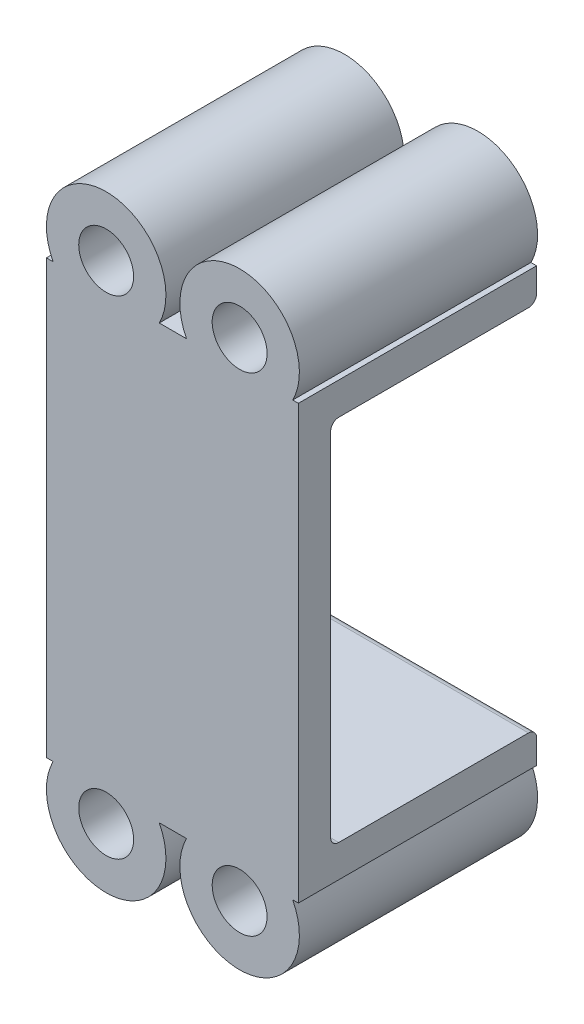
ISO-10303-21;
HEADER;
FILE_DESCRIPTION(('STEP AP214'),'2;1');
FILE_NAME('part.step','',(''),(''),'','','');
FILE_SCHEMA(('AUTOMOTIVE_DESIGN { 1 0 10303 214 1 1 1 1 }'));
ENDSEC;
DATA;
#1=APPLICATION_CONTEXT('core data for automotive mechanical design processes');
#2=APPLICATION_PROTOCOL_DEFINITION('international standard','automotive_design',2000,#1);
#3=PRODUCT_CONTEXT('',#1,'mechanical');
#4=PRODUCT('Part','Part','',(#3));
#5=PRODUCT_RELATED_PRODUCT_CATEGORY('part','',(#4));
#6=PRODUCT_DEFINITION_FORMATION('','',#4);
#7=PRODUCT_DEFINITION_CONTEXT('part definition',#1,'design');
#8=PRODUCT_DEFINITION('design','',#6,#7);
#9=PRODUCT_DEFINITION_SHAPE('','',#8);
#10=(LENGTH_UNIT() NAMED_UNIT(*) SI_UNIT(.MILLI.,.METRE.));
#11=(NAMED_UNIT(*) PLANE_ANGLE_UNIT() SI_UNIT($,.RADIAN.));
#12=(NAMED_UNIT(*) SI_UNIT($,.STERADIAN.) SOLID_ANGLE_UNIT());
#13=UNCERTAINTY_MEASURE_WITH_UNIT(LENGTH_MEASURE(1.E-05),#10,'distance_accuracy_value','');
#14=(GEOMETRIC_REPRESENTATION_CONTEXT(3) GLOBAL_UNCERTAINTY_ASSIGNED_CONTEXT((#13)) GLOBAL_UNIT_ASSIGNED_CONTEXT((#10,
#11,#12)) REPRESENTATION_CONTEXT('',''));
#15=CARTESIAN_POINT('',(0.,0.,0.));
#16=DIRECTION('',(0.,0.,1.));
#17=DIRECTION('',(1.,0.,0.));
#18=AXIS2_PLACEMENT_3D('',#15,#16,#17);
#19=CARTESIAN_POINT('',(-7.83156717792366,11.4,2.));
#20=DIRECTION('',(1.,0.,0.));
#21=DIRECTION('',(0.,1.,0.));
#22=AXIS2_PLACEMENT_3D('',#19,#20,#21);
#23=PLANE('',#22);
#24=DIRECTION('',(0.,0.,1.));
#25=VECTOR('',#24,1.);
#26=CARTESIAN_POINT('',(-7.83156717792366,-11.4,-12.75));
#27=LINE('',#26,#25);
#28=CARTESIAN_POINT('',(-7.83156717792366,-11.4,-12.25));
#29=VERTEX_POINT('',#28);
#30=CARTESIAN_POINT('',(-7.83156717792366,-11.4,-0.5));
#31=VERTEX_POINT('',#30);
#32=EDGE_CURVE('E232',#29,#31,#27,.T.);
#33=ORIENTED_EDGE('',*,*,#32,.F.);
#34=CARTESIAN_POINT('',(-7.83156717792366,-11.9,-12.25));
#35=DIRECTION('',(1.,0.,0.));
#36=DIRECTION('',(0.,1.,0.));
#37=AXIS2_PLACEMENT_3D('',#34,#35,#36);
#38=CIRCLE('',#37,0.5);
#39=CARTESIAN_POINT('',(-7.83156717792366,-11.9,-12.75));
#40=VERTEX_POINT('',#39);
#41=EDGE_CURVE('E289',#29,#40,#38,.F.);
#42=ORIENTED_EDGE('',*,*,#41,.T.);
#43=DIRECTION('',(0.,-1.,0.));
#44=VECTOR('',#43,1.);
#45=CARTESIAN_POINT('',(-7.83156717792366,-13.4,-12.75));
#46=LINE('',#45,#44);
#47=CARTESIAN_POINT('',(-7.83156717792366,-13.4,-12.75));
#48=VERTEX_POINT('',#47);
#49=EDGE_CURVE('E215',#40,#48,#46,.T.);
#50=ORIENTED_EDGE('',*,*,#49,.T.);
#51=DIRECTION('',(0.,0.,1.));
#52=VECTOR('',#51,1.);
#53=CARTESIAN_POINT('',(-7.83156717792366,-13.4,-12.75));
#54=LINE('',#53,#52);
#55=CARTESIAN_POINT('',(-7.83156717792366,-13.4,2.));
#56=VERTEX_POINT('',#55);
#57=EDGE_CURVE('E229',#48,#56,#54,.T.);
#58=ORIENTED_EDGE('',*,*,#57,.T.);
#59=DIRECTION('',(0.,-1.,0.));
#60=VECTOR('',#59,1.);
#61=CARTESIAN_POINT('',(-7.83156717792366,11.4,2.));
#62=LINE('',#61,#60);
#63=CARTESIAN_POINT('',(-7.83156717792366,13.4,2.));
#64=VERTEX_POINT('',#63);
#65=EDGE_CURVE('E264',#64,#56,#62,.T.);
#66=ORIENTED_EDGE('',*,*,#65,.F.);
#67=DIRECTION('',(0.,0.,1.));
#68=VECTOR('',#67,1.);
#69=CARTESIAN_POINT('',(-7.83156717792366,13.4,-12.75));
#70=LINE('',#69,#68);
#71=CARTESIAN_POINT('',(-7.83156717792366,13.4,-12.75));
#72=VERTEX_POINT('',#71);
#73=EDGE_CURVE('E273',#72,#64,#70,.T.);
#74=ORIENTED_EDGE('',*,*,#73,.F.);
#75=DIRECTION('',(0.,-1.,0.));
#76=VECTOR('',#75,1.);
#77=CARTESIAN_POINT('',(-7.83156717792366,13.4,-12.75));
#78=LINE('',#77,#76);
#79=CARTESIAN_POINT('',(-7.83156717792366,11.9,-12.75));
#80=VERTEX_POINT('',#79);
#81=EDGE_CURVE('E357',#72,#80,#78,.T.);
#82=ORIENTED_EDGE('',*,*,#81,.T.);
#83=CARTESIAN_POINT('',(-7.83156717792366,11.9,-12.25));
#84=DIRECTION('',(1.,0.,0.));
#85=DIRECTION('',(0.,1.,0.));
#86=AXIS2_PLACEMENT_3D('',#83,#84,#85);
#87=CIRCLE('',#86,0.5);
#88=CARTESIAN_POINT('',(-7.83156717792366,11.4,-12.25));
#89=VERTEX_POINT('',#88);
#90=EDGE_CURVE('E287',#80,#89,#87,.F.);
#91=ORIENTED_EDGE('',*,*,#90,.T.);
#92=DIRECTION('',(0.,0.,1.));
#93=VECTOR('',#92,1.);
#94=CARTESIAN_POINT('',(-7.83156717792366,11.4,-12.75));
#95=LINE('',#94,#93);
#96=CARTESIAN_POINT('',(-7.83156717792366,11.4,-0.5));
#97=VERTEX_POINT('',#96);
#98=EDGE_CURVE('E276',#89,#97,#95,.T.);
#99=ORIENTED_EDGE('',*,*,#98,.T.);
#100=CARTESIAN_POINT('',(-7.83156717792366,10.9,-0.5));
#101=DIRECTION('',(1.,0.,0.));
#102=DIRECTION('',(0.,1.,0.));
#103=AXIS2_PLACEMENT_3D('',#100,#101,#102);
#104=CIRCLE('',#103,0.5);
#105=CARTESIAN_POINT('',(-7.83156717792366,10.9,0.));
#106=VERTEX_POINT('',#105);
#107=EDGE_CURVE('E45',#97,#106,#104,.T.);
#108=ORIENTED_EDGE('',*,*,#107,.T.);
#109=DIRECTION('',(0.,-1.,0.));
#110=VECTOR('',#109,1.);
#111=CARTESIAN_POINT('',(-7.83156717792366,11.4,0.));
#112=LINE('',#111,#110);
#113=CARTESIAN_POINT('',(-7.83156717792366,-10.9,0.));
#114=VERTEX_POINT('',#113);
#115=EDGE_CURVE('E255',#106,#114,#112,.T.);
#116=ORIENTED_EDGE('',*,*,#115,.T.);
#117=CARTESIAN_POINT('',(-7.83156717792366,-10.9,-0.5));
#118=DIRECTION('',(1.,0.,0.));
#119=DIRECTION('',(0.,1.,0.));
#120=AXIS2_PLACEMENT_3D('',#117,#118,#119);
#121=CIRCLE('',#120,0.5);
#122=EDGE_CURVE('E308',#114,#31,#121,.T.);
#123=ORIENTED_EDGE('',*,*,#122,.T.);
#124=EDGE_LOOP('',(#33,#42,#50,#58,#66,#74,#82,#91,#99,#108,#116,#123));
#125=FACE_BOUND('',#124,.T.);
#126=ADVANCED_FACE('F37',(#125),#23,.F.);
#127=CARTESIAN_POINT('',(7.76843282207634,11.4,2.));
#128=DIRECTION('',(-1.,0.,0.));
#129=DIRECTION('',(0.,-1.,0.));
#130=AXIS2_PLACEMENT_3D('',#127,#128,#129);
#131=PLANE('',#130);
#132=DIRECTION('',(0.,1.,0.));
#133=VECTOR('',#132,1.);
#134=CARTESIAN_POINT('',(7.76843282207634,-13.4,-12.75));
#135=LINE('',#134,#133);
#136=CARTESIAN_POINT('',(7.76843282207634,-13.4,-12.75));
#137=VERTEX_POINT('',#136);
#138=CARTESIAN_POINT('',(7.76843282207634,-11.9,-12.75));
#139=VERTEX_POINT('',#138);
#140=EDGE_CURVE('E212',#137,#139,#135,.T.);
#141=ORIENTED_EDGE('',*,*,#140,.T.);
#142=CARTESIAN_POINT('',(7.76843282207634,-11.9,-12.25));
#143=DIRECTION('',(-1.,0.,0.));
#144=DIRECTION('',(0.,-1.,0.));
#145=AXIS2_PLACEMENT_3D('',#142,#143,#144);
#146=CIRCLE('',#145,0.5);
#147=CARTESIAN_POINT('',(7.76843282207634,-11.4,-12.25));
#148=VERTEX_POINT('',#147);
#149=EDGE_CURVE('E296',#139,#148,#146,.F.);
#150=ORIENTED_EDGE('',*,*,#149,.T.);
#151=DIRECTION('',(0.,0.,1.));
#152=VECTOR('',#151,1.);
#153=CARTESIAN_POINT('',(7.76843282207634,-11.4,-12.75));
#154=LINE('',#153,#152);
#155=CARTESIAN_POINT('',(7.76843282207634,-11.4,-0.5));
#156=VERTEX_POINT('',#155);
#157=EDGE_CURVE('E241',#148,#156,#154,.T.);
#158=ORIENTED_EDGE('',*,*,#157,.T.);
#159=CARTESIAN_POINT('',(7.76843282207634,-10.9,-0.5));
#160=DIRECTION('',(-1.,0.,0.));
#161=DIRECTION('',(0.,-1.,0.));
#162=AXIS2_PLACEMENT_3D('',#159,#160,#161);
#163=CIRCLE('',#162,0.5);
#164=CARTESIAN_POINT('',(7.76843282207634,-10.9,0.));
#165=VERTEX_POINT('',#164);
#166=EDGE_CURVE('E306',#156,#165,#163,.T.);
#167=ORIENTED_EDGE('',*,*,#166,.T.);
#168=DIRECTION('',(0.,1.,0.));
#169=VECTOR('',#168,1.);
#170=CARTESIAN_POINT('',(7.76843282207634,11.4,0.));
#171=LINE('',#170,#169);
#172=CARTESIAN_POINT('',(7.76843282207634,10.9,0.));
#173=VERTEX_POINT('',#172);
#174=EDGE_CURVE('E258',#165,#173,#171,.T.);
#175=ORIENTED_EDGE('',*,*,#174,.T.);
#176=CARTESIAN_POINT('',(7.76843282207634,10.9,-0.5));
#177=DIRECTION('',(-1.,0.,0.));
#178=DIRECTION('',(0.,-1.,0.));
#179=AXIS2_PLACEMENT_3D('',#176,#177,#178);
#180=CIRCLE('',#179,0.5);
#181=CARTESIAN_POINT('',(7.76843282207634,11.4,-0.5));
#182=VERTEX_POINT('',#181);
#183=EDGE_CURVE('E11',#173,#182,#180,.T.);
#184=ORIENTED_EDGE('',*,*,#183,.T.);
#185=DIRECTION('',(0.,0.,1.));
#186=VECTOR('',#185,1.);
#187=CARTESIAN_POINT('',(7.76843282207634,11.4,-12.75));
#188=LINE('',#187,#186);
#189=CARTESIAN_POINT('',(7.76843282207634,11.4,-12.25));
#190=VERTEX_POINT('',#189);
#191=EDGE_CURVE('E285',#190,#182,#188,.T.);
#192=ORIENTED_EDGE('',*,*,#191,.F.);
#193=CARTESIAN_POINT('',(7.76843282207634,11.9,-12.25));
#194=DIRECTION('',(-1.,0.,0.));
#195=DIRECTION('',(0.,-1.,0.));
#196=AXIS2_PLACEMENT_3D('',#193,#194,#195);
#197=CIRCLE('',#196,0.5);
#198=CARTESIAN_POINT('',(7.76843282207634,11.9,-12.75));
#199=VERTEX_POINT('',#198);
#200=EDGE_CURVE('E52',#190,#199,#197,.F.);
#201=ORIENTED_EDGE('',*,*,#200,.T.);
#202=DIRECTION('',(0.,1.,0.));
#203=VECTOR('',#202,1.);
#204=CARTESIAN_POINT('',(7.76843282207634,13.4,-12.75));
#205=LINE('',#204,#203);
#206=CARTESIAN_POINT('',(7.76843282207634,13.4,-12.75));
#207=VERTEX_POINT('',#206);
#208=EDGE_CURVE('E361',#199,#207,#205,.T.);
#209=ORIENTED_EDGE('',*,*,#208,.T.);
#210=DIRECTION('',(0.,0.,1.));
#211=VECTOR('',#210,1.);
#212=CARTESIAN_POINT('',(7.76843282207634,13.4,-12.75));
#213=LINE('',#212,#211);
#214=CARTESIAN_POINT('',(7.76843282207634,13.4,2.));
#215=VERTEX_POINT('',#214);
#216=EDGE_CURVE('E294',#207,#215,#213,.T.);
#217=ORIENTED_EDGE('',*,*,#216,.T.);
#218=DIRECTION('',(0.,1.,0.));
#219=VECTOR('',#218,1.);
#220=CARTESIAN_POINT('',(7.76843282207634,11.4,2.));
#221=LINE('',#220,#219);
#222=CARTESIAN_POINT('',(7.76843282207634,-13.4,2.));
#223=VERTEX_POINT('',#222);
#224=EDGE_CURVE('E251',#223,#215,#221,.T.);
#225=ORIENTED_EDGE('',*,*,#224,.F.);
#226=DIRECTION('',(0.,0.,1.));
#227=VECTOR('',#226,1.);
#228=CARTESIAN_POINT('',(7.76843282207634,-13.4,-12.75));
#229=LINE('',#228,#227);
#230=EDGE_CURVE('E246',#137,#223,#229,.T.);
#231=ORIENTED_EDGE('',*,*,#230,.F.);
#232=EDGE_LOOP('',(#141,#150,#158,#167,#175,#184,#192,#201,#209,#217,#225,#231));
#233=FACE_BOUND('',#232,.T.);
#234=ADVANCED_FACE('F324',(#233),#131,.F.);
#235=CARTESIAN_POINT('',(0.,0.,2.));
#236=DIRECTION('',(0.,0.,1.));
#237=DIRECTION('',(1.,0.,0.));
#238=AXIS2_PLACEMENT_3D('',#235,#236,#237);
#239=PLANE('',#238);
#240=ORIENTED_EDGE('',*,*,#65,.T.);
#241=DIRECTION('',(1.,0.,0.));
#242=VECTOR('',#241,1.);
#243=CARTESIAN_POINT('',(-7.41790252295466,-13.4,2.));
#244=LINE('',#243,#242);
#245=CARTESIAN_POINT('',(-7.41790252295466,-13.4,2.));
#246=VERTEX_POINT('',#245);
#247=EDGE_CURVE('E199',#56,#246,#244,.T.);
#248=ORIENTED_EDGE('',*,*,#247,.T.);
#249=CARTESIAN_POINT('',(-4.13156717792366,-15.1,2.));
#250=DIRECTION('',(0.,0.,1.));
#251=DIRECTION('',(1.,0.,0.));
#252=AXIS2_PLACEMENT_3D('',#249,#250,#251);
#253=CIRCLE('',#252,3.7);
#254=CARTESIAN_POINT('',(-0.845231832892662,-13.4,2.));
#255=VERTEX_POINT('',#254);
#256=EDGE_CURVE('E218',#246,#255,#253,.T.);
#257=ORIENTED_EDGE('',*,*,#256,.T.);
#258=DIRECTION('',(1.,0.,0.));
#259=VECTOR('',#258,1.);
#260=CARTESIAN_POINT('',(0.845231832892663,-13.4,2.));
#261=LINE('',#260,#259);
#262=CARTESIAN_POINT('',(0.845231832892664,-13.4,2.));
#263=VERTEX_POINT('',#262);
#264=EDGE_CURVE('E177',#255,#263,#261,.T.);
#265=ORIENTED_EDGE('',*,*,#264,.T.);
#266=CARTESIAN_POINT('',(4.13156717792366,-15.1,2.));
#267=DIRECTION('',(0.,0.,1.));
#268=DIRECTION('',(-1.,0.,0.));
#269=AXIS2_PLACEMENT_3D('',#266,#267,#268);
#270=CIRCLE('',#269,3.7);
#271=CARTESIAN_POINT('',(7.41790252295466,-13.4,2.));
#272=VERTEX_POINT('',#271);
#273=EDGE_CURVE('E222',#263,#272,#270,.T.);
#274=ORIENTED_EDGE('',*,*,#273,.T.);
#275=DIRECTION('',(1.,0.,0.));
#276=VECTOR('',#275,1.);
#277=CARTESIAN_POINT('',(7.76843282207634,-13.4,2.));
#278=LINE('',#277,#276);
#279=EDGE_CURVE('E202',#272,#223,#278,.T.);
#280=ORIENTED_EDGE('',*,*,#279,.T.);
#281=ORIENTED_EDGE('',*,*,#224,.T.);
#282=DIRECTION('',(-1.,0.,0.));
#283=VECTOR('',#282,1.);
#284=CARTESIAN_POINT('',(7.76843282207634,13.4,2.));
#285=LINE('',#284,#283);
#286=CARTESIAN_POINT('',(7.41790252295466,13.4,2.));
#287=VERTEX_POINT('',#286);
#288=EDGE_CURVE('E384',#215,#287,#285,.T.);
#289=ORIENTED_EDGE('',*,*,#288,.T.);
#290=CARTESIAN_POINT('',(4.13156717792366,15.1,2.));
#291=DIRECTION('',(0.,0.,1.));
#292=DIRECTION('',(1.,0.,0.));
#293=AXIS2_PLACEMENT_3D('',#290,#291,#292);
#294=CIRCLE('',#293,3.7);
#295=CARTESIAN_POINT('',(0.845231832892663,13.4,2.));
#296=VERTEX_POINT('',#295);
#297=EDGE_CURVE('E371',#287,#296,#294,.T.);
#298=ORIENTED_EDGE('',*,*,#297,.T.);
#299=DIRECTION('',(-1.,0.,0.));
#300=VECTOR('',#299,1.);
#301=CARTESIAN_POINT('',(0.845231832892663,13.4,2.));
#302=LINE('',#301,#300);
#303=CARTESIAN_POINT('',(-0.845231832892663,13.4,2.));
#304=VERTEX_POINT('',#303);
#305=EDGE_CURVE('E374',#296,#304,#302,.T.);
#306=ORIENTED_EDGE('',*,*,#305,.T.);
#307=CARTESIAN_POINT('',(-4.13156717792366,15.1,2.));
#308=DIRECTION('',(0.,0.,1.));
#309=DIRECTION('',(-1.,0.,0.));
#310=AXIS2_PLACEMENT_3D('',#307,#308,#309);
#311=CIRCLE('',#310,3.7);
#312=CARTESIAN_POINT('',(-7.41790252295466,13.4,2.));
#313=VERTEX_POINT('',#312);
#314=EDGE_CURVE('E378',#304,#313,#311,.T.);
#315=ORIENTED_EDGE('',*,*,#314,.T.);
#316=DIRECTION('',(-1.,0.,0.));
#317=VECTOR('',#316,1.);
#318=CARTESIAN_POINT('',(-7.41790252295466,13.4,2.));
#319=LINE('',#318,#317);
#320=EDGE_CURVE('E381',#313,#64,#319,.T.);
#321=ORIENTED_EDGE('',*,*,#320,.T.);
#322=EDGE_LOOP('',(#240,#248,#257,#265,#274,#280,#281,#289,#298,#306,#315,#321));
#323=FACE_BOUND('',#322,.T.);
#324=CARTESIAN_POINT('',(-4.13156717792366,15.1,2.));
#325=DIRECTION('',(0.,0.,1.));
#326=DIRECTION('',(-1.,0.,0.));
#327=AXIS2_PLACEMENT_3D('',#324,#325,#326);
#328=CIRCLE('',#327,1.7);
#329=CARTESIAN_POINT('',(-5.83156717792366,15.1,2.));
#330=VERTEX_POINT('',#329);
#331=EDGE_CURVE('E228',#330,#330,#328,.T.);
#332=ORIENTED_EDGE('',*,*,#331,.F.);
#333=EDGE_LOOP('',(#332));
#334=FACE_BOUND('',#333,.T.);
#335=CARTESIAN_POINT('',(4.13156717792366,15.1,2.));
#336=DIRECTION('',(0.,0.,1.));
#337=DIRECTION('',(1.,0.,0.));
#338=AXIS2_PLACEMENT_3D('',#335,#336,#337);
#339=CIRCLE('',#338,1.7);
#340=CARTESIAN_POINT('',(5.83156717792366,15.1,2.));
#341=VERTEX_POINT('',#340);
#342=EDGE_CURVE('E408',#341,#341,#339,.T.);
#343=ORIENTED_EDGE('',*,*,#342,.F.);
#344=EDGE_LOOP('',(#343));
#345=FACE_BOUND('',#344,.T.);
#346=CARTESIAN_POINT('',(4.13156717792366,-15.1,2.));
#347=DIRECTION('',(0.,0.,1.));
#348=DIRECTION('',(-1.,0.,0.));
#349=AXIS2_PLACEMENT_3D('',#346,#347,#348);
#350=CIRCLE('',#349,1.7);
#351=CARTESIAN_POINT('',(2.43156717792366,-15.1,2.));
#352=VERTEX_POINT('',#351);
#353=EDGE_CURVE('E497',#352,#352,#350,.T.);
#354=ORIENTED_EDGE('',*,*,#353,.F.);
#355=EDGE_LOOP('',(#354));
#356=FACE_BOUND('',#355,.T.);
#357=CARTESIAN_POINT('',(-4.13156717792366,-15.1,2.));
#358=DIRECTION('',(0.,0.,1.));
#359=DIRECTION('',(1.,0.,0.));
#360=AXIS2_PLACEMENT_3D('',#357,#358,#359);
#361=CIRCLE('',#360,1.7);
#362=CARTESIAN_POINT('',(-2.43156717792366,-15.1,2.));
#363=VERTEX_POINT('',#362);
#364=EDGE_CURVE('E205',#363,#363,#361,.T.);
#365=ORIENTED_EDGE('',*,*,#364,.F.);
#366=EDGE_LOOP('',(#365));
#367=FACE_BOUND('',#366,.T.);
#368=ADVANCED_FACE('F328',(#323,#334,#345,#356,#367),#239,.T.);
#369=CARTESIAN_POINT('',(0.,0.,0.));
#370=DIRECTION('',(0.,0.,1.));
#371=DIRECTION('',(1.,0.,0.));
#372=AXIS2_PLACEMENT_3D('',#369,#370,#371);
#373=PLANE('',#372);
#374=ORIENTED_EDGE('',*,*,#174,.F.);
#375=DIRECTION('',(1.,0.,0.));
#376=VECTOR('',#375,1.);
#377=CARTESIAN_POINT('',(0.,-10.9,0.));
#378=LINE('',#377,#376);
#379=EDGE_CURVE('E286',#165,#114,#378,.F.);
#380=ORIENTED_EDGE('',*,*,#379,.T.);
#381=ORIENTED_EDGE('',*,*,#115,.F.);
#382=DIRECTION('',(-1.,0.,0.));
#383=VECTOR('',#382,1.);
#384=CARTESIAN_POINT('',(0.,10.9,0.));
#385=LINE('',#384,#383);
#386=EDGE_CURVE('E254',#106,#173,#385,.F.);
#387=ORIENTED_EDGE('',*,*,#386,.T.);
#388=EDGE_LOOP('',(#374,#380,#381,#387));
#389=FACE_BOUND('',#388,.T.);
#390=ADVANCED_FACE('F319',(#389),#373,.F.);
#391=CARTESIAN_POINT('',(4.13156717792366,15.1,-12.75));
#392=DIRECTION('',(0.,0.,1.));
#393=DIRECTION('',(1.,0.,0.));
#394=AXIS2_PLACEMENT_3D('',#391,#392,#393);
#395=CYLINDRICAL_SURFACE('',#394,3.7);
#396=ORIENTED_EDGE('',*,*,#297,.F.);
#397=DIRECTION('',(0.,0.,1.));
#398=VECTOR('',#397,1.);
#399=CARTESIAN_POINT('',(7.41790252295466,13.4,-12.75));
#400=LINE('',#399,#398);
#401=CARTESIAN_POINT('',(7.41790252295466,13.4,-12.75));
#402=VERTEX_POINT('',#401);
#403=EDGE_CURVE('E259',#402,#287,#400,.T.);
#404=ORIENTED_EDGE('',*,*,#403,.F.);
#405=CARTESIAN_POINT('',(4.13156717792366,15.1,-12.75));
#406=DIRECTION('',(0.,0.,1.));
#407=DIRECTION('',(1.,0.,0.));
#408=AXIS2_PLACEMENT_3D('',#405,#406,#407);
#409=CIRCLE('',#408,3.7);
#410=CARTESIAN_POINT('',(0.845231832892663,13.4,-12.75));
#411=VERTEX_POINT('',#410);
#412=EDGE_CURVE('E387',#402,#411,#409,.T.);
#413=ORIENTED_EDGE('',*,*,#412,.T.);
#414=DIRECTION('',(0.,0.,1.));
#415=VECTOR('',#414,1.);
#416=CARTESIAN_POINT('',(0.845231832892663,13.4,-12.75));
#417=LINE('',#416,#415);
#418=EDGE_CURVE('E266',#411,#296,#417,.T.);
#419=ORIENTED_EDGE('',*,*,#418,.T.);
#420=EDGE_LOOP('',(#396,#404,#413,#419));
#421=FACE_BOUND('',#420,.T.);
#422=ADVANCED_FACE('F432',(#421),#395,.T.);
#423=CARTESIAN_POINT('',(7.76843282207634,13.4,-12.75));
#424=DIRECTION('',(0.,1.,0.));
#425=DIRECTION('',(-1.,0.,0.));
#426=AXIS2_PLACEMENT_3D('',#423,#424,#425);
#427=PLANE('',#426);
#428=ORIENTED_EDGE('',*,*,#288,.F.);
#429=ORIENTED_EDGE('',*,*,#216,.F.);
#430=DIRECTION('',(-1.,0.,0.));
#431=VECTOR('',#430,1.);
#432=CARTESIAN_POINT('',(7.76843282207634,13.4,-12.75));
#433=LINE('',#432,#431);
#434=EDGE_CURVE('E269',#207,#402,#433,.T.);
#435=ORIENTED_EDGE('',*,*,#434,.T.);
#436=ORIENTED_EDGE('',*,*,#403,.T.);
#437=EDGE_LOOP('',(#428,#429,#435,#436));
#438=FACE_BOUND('',#437,.T.);
#439=ADVANCED_FACE('F394',(#438),#427,.T.);
#440=CARTESIAN_POINT('',(-7.83156717792366,11.4,-12.75));
#441=DIRECTION('',(0.,-1.,0.));
#442=DIRECTION('',(0.,0.,-1.));
#443=AXIS2_PLACEMENT_3D('',#440,#441,#442);
#444=PLANE('',#443);
#445=ORIENTED_EDGE('',*,*,#98,.F.);
#446=DIRECTION('',(1.,0.,0.));
#447=VECTOR('',#446,1.);
#448=CARTESIAN_POINT('',(7.76843282207634,11.4,-12.25));
#449=LINE('',#448,#447);
#450=EDGE_CURVE('E301',#89,#190,#449,.T.);
#451=ORIENTED_EDGE('',*,*,#450,.T.);
#452=ORIENTED_EDGE('',*,*,#191,.T.);
#453=DIRECTION('',(-1.,0.,0.));
#454=VECTOR('',#453,1.);
#455=CARTESIAN_POINT('',(-7.83156717792366,11.4,-0.5));
#456=LINE('',#455,#454);
#457=EDGE_CURVE('E298',#182,#97,#456,.T.);
#458=ORIENTED_EDGE('',*,*,#457,.T.);
#459=EDGE_LOOP('',(#445,#451,#452,#458));
#460=FACE_BOUND('',#459,.T.);
#461=ADVANCED_FACE('F322',(#460),#444,.T.);
#462=CARTESIAN_POINT('',(-7.41790252295466,13.4,-12.75));
#463=DIRECTION('',(0.,1.,0.));
#464=DIRECTION('',(-1.,0.,0.));
#465=AXIS2_PLACEMENT_3D('',#462,#463,#464);
#466=PLANE('',#465);
#467=ORIENTED_EDGE('',*,*,#320,.F.);
#468=DIRECTION('',(0.,0.,1.));
#469=VECTOR('',#468,1.);
#470=CARTESIAN_POINT('',(-7.41790252295466,13.4,-12.75));
#471=LINE('',#470,#469);
#472=CARTESIAN_POINT('',(-7.41790252295466,13.4,-12.75));
#473=VERTEX_POINT('',#472);
#474=EDGE_CURVE('E271',#473,#313,#471,.T.);
#475=ORIENTED_EDGE('',*,*,#474,.F.);
#476=DIRECTION('',(-1.,0.,0.));
#477=VECTOR('',#476,1.);
#478=CARTESIAN_POINT('',(-7.41790252295466,13.4,-12.75));
#479=LINE('',#478,#477);
#480=EDGE_CURVE('E362',#473,#72,#479,.T.);
#481=ORIENTED_EDGE('',*,*,#480,.T.);
#482=ORIENTED_EDGE('',*,*,#73,.T.);
#483=EDGE_LOOP('',(#467,#475,#481,#482));
#484=FACE_BOUND('',#483,.T.);
#485=ADVANCED_FACE('F445',(#484),#466,.T.);
#486=CARTESIAN_POINT('',(-4.13156717792366,15.1,-12.75));
#487=DIRECTION('',(0.,0.,1.));
#488=DIRECTION('',(1.,0.,0.));
#489=AXIS2_PLACEMENT_3D('',#486,#487,#488);
#490=CYLINDRICAL_SURFACE('',#489,3.7);
#491=ORIENTED_EDGE('',*,*,#314,.F.);
#492=DIRECTION('',(0.,0.,1.));
#493=VECTOR('',#492,1.);
#494=CARTESIAN_POINT('',(-0.845231832892663,13.4,-12.75));
#495=LINE('',#494,#493);
#496=CARTESIAN_POINT('',(-0.845231832892663,13.4,-12.75));
#497=VERTEX_POINT('',#496);
#498=EDGE_CURVE('E268',#497,#304,#495,.T.);
#499=ORIENTED_EDGE('',*,*,#498,.F.);
#500=CARTESIAN_POINT('',(-4.13156717792366,15.1,-12.75));
#501=DIRECTION('',(0.,0.,1.));
#502=DIRECTION('',(-1.,0.,0.));
#503=AXIS2_PLACEMENT_3D('',#500,#501,#502);
#504=CIRCLE('',#503,3.7);
#505=EDGE_CURVE('E365',#497,#473,#504,.T.);
#506=ORIENTED_EDGE('',*,*,#505,.T.);
#507=ORIENTED_EDGE('',*,*,#474,.T.);
#508=EDGE_LOOP('',(#491,#499,#506,#507));
#509=FACE_BOUND('',#508,.T.);
#510=ADVANCED_FACE('F423',(#509),#490,.T.);
#511=CARTESIAN_POINT('',(0.845231832892663,13.4,-12.75));
#512=DIRECTION('',(0.,1.,0.));
#513=DIRECTION('',(-1.,0.,0.));
#514=AXIS2_PLACEMENT_3D('',#511,#512,#513);
#515=PLANE('',#514);
#516=ORIENTED_EDGE('',*,*,#305,.F.);
#517=ORIENTED_EDGE('',*,*,#418,.F.);
#518=DIRECTION('',(-1.,0.,0.));
#519=VECTOR('',#518,1.);
#520=CARTESIAN_POINT('',(0.845231832892663,13.4,-12.75));
#521=LINE('',#520,#519);
#522=EDGE_CURVE('E417',#411,#497,#521,.T.);
#523=ORIENTED_EDGE('',*,*,#522,.T.);
#524=ORIENTED_EDGE('',*,*,#498,.T.);
#525=EDGE_LOOP('',(#516,#517,#523,#524));
#526=FACE_BOUND('',#525,.T.);
#527=ADVANCED_FACE('F430',(#526),#515,.T.);
#528=CARTESIAN_POINT('',(4.13156717792366,15.1,-12.75));
#529=DIRECTION('',(0.,0.,1.));
#530=DIRECTION('',(1.,0.,0.));
#531=AXIS2_PLACEMENT_3D('',#528,#529,#530);
#532=PLANE('',#531);
#533=CARTESIAN_POINT('',(-4.13156717792366,15.1,-12.75));
#534=DIRECTION('',(0.,0.,1.));
#535=DIRECTION('',(-1.,0.,0.));
#536=AXIS2_PLACEMENT_3D('',#533,#534,#535);
#537=CIRCLE('',#536,1.7);
#538=CARTESIAN_POINT('',(-5.83156717792366,15.1,-12.75));
#539=VERTEX_POINT('',#538);
#540=EDGE_CURVE('E405',#539,#539,#537,.T.);
#541=ORIENTED_EDGE('',*,*,#540,.T.);
#542=EDGE_LOOP('',(#541));
#543=FACE_BOUND('',#542,.T.);
#544=CARTESIAN_POINT('',(4.13156717792366,15.1,-12.75));
#545=DIRECTION('',(0.,0.,1.));
#546=DIRECTION('',(1.,0.,0.));
#547=AXIS2_PLACEMENT_3D('',#544,#545,#546);
#548=CIRCLE('',#547,1.7);
#549=CARTESIAN_POINT('',(5.83156717792366,15.1,-12.75));
#550=VERTEX_POINT('',#549);
#551=EDGE_CURVE('E375',#550,#550,#548,.T.);
#552=ORIENTED_EDGE('',*,*,#551,.T.);
#553=EDGE_LOOP('',(#552));
#554=FACE_BOUND('',#553,.T.);
#555=ORIENTED_EDGE('',*,*,#208,.F.);
#556=DIRECTION('',(1.,0.,0.));
#557=VECTOR('',#556,1.);
#558=CARTESIAN_POINT('',(-7.83156717792366,11.9,-12.75));
#559=LINE('',#558,#557);
#560=EDGE_CURVE('E304',#199,#80,#559,.F.);
#561=ORIENTED_EDGE('',*,*,#560,.T.);
#562=ORIENTED_EDGE('',*,*,#81,.F.);
#563=ORIENTED_EDGE('',*,*,#480,.F.);
#564=ORIENTED_EDGE('',*,*,#505,.F.);
#565=ORIENTED_EDGE('',*,*,#522,.F.);
#566=ORIENTED_EDGE('',*,*,#412,.F.);
#567=ORIENTED_EDGE('',*,*,#434,.F.);
#568=EDGE_LOOP('',(#555,#561,#562,#563,#564,#565,#566,#567));
#569=FACE_BOUND('',#568,.T.);
#570=ADVANCED_FACE('F426',(#543,#554,#569),#532,.F.);
#571=CARTESIAN_POINT('',(4.13156717792366,15.1,-12.75));
#572=DIRECTION('',(0.,0.,1.));
#573=DIRECTION('',(1.,0.,0.));
#574=AXIS2_PLACEMENT_3D('',#571,#572,#573);
#575=CYLINDRICAL_SURFACE('',#574,1.7);
#576=ORIENTED_EDGE('',*,*,#551,.F.);
#577=EDGE_LOOP('',(#576));
#578=FACE_BOUND('',#577,.T.);
#579=ORIENTED_EDGE('',*,*,#342,.T.);
#580=EDGE_LOOP('',(#579));
#581=FACE_BOUND('',#580,.T.);
#582=ADVANCED_FACE('F453',(#578,#581),#575,.F.);
#583=CARTESIAN_POINT('',(-4.13156717792366,15.1,-12.75));
#584=DIRECTION('',(0.,0.,1.));
#585=DIRECTION('',(1.,0.,0.));
#586=AXIS2_PLACEMENT_3D('',#583,#584,#585);
#587=CYLINDRICAL_SURFACE('',#586,1.7);
#588=ORIENTED_EDGE('',*,*,#540,.F.);
#589=EDGE_LOOP('',(#588));
#590=FACE_BOUND('',#589,.T.);
#591=ORIENTED_EDGE('',*,*,#331,.T.);
#592=EDGE_LOOP('',(#591));
#593=FACE_BOUND('',#592,.T.);
#594=ADVANCED_FACE('F457',(#590,#593),#587,.F.);
#595=CARTESIAN_POINT('',(-4.13156717792366,-15.1,-12.75));
#596=DIRECTION('',(0.,0.,1.));
#597=DIRECTION('',(1.,0.,0.));
#598=AXIS2_PLACEMENT_3D('',#595,#596,#597);
#599=CYLINDRICAL_SURFACE('',#598,3.7);
#600=ORIENTED_EDGE('',*,*,#256,.F.);
#601=DIRECTION('',(0.,0.,1.));
#602=VECTOR('',#601,1.);
#603=CARTESIAN_POINT('',(-7.41790252295466,-13.4,-12.75));
#604=LINE('',#603,#602);
#605=CARTESIAN_POINT('',(-7.41790252295466,-13.4,-12.75));
#606=VERTEX_POINT('',#605);
#607=EDGE_CURVE('E198',#606,#246,#604,.T.);
#608=ORIENTED_EDGE('',*,*,#607,.F.);
#609=CARTESIAN_POINT('',(-4.13156717792366,-15.1,-12.75));
#610=DIRECTION('',(0.,0.,1.));
#611=DIRECTION('',(1.,0.,0.));
#612=AXIS2_PLACEMENT_3D('',#609,#610,#611);
#613=CIRCLE('',#612,3.7);
#614=CARTESIAN_POINT('',(-0.845231832892662,-13.4,-12.75));
#615=VERTEX_POINT('',#614);
#616=EDGE_CURVE('E191',#606,#615,#613,.T.);
#617=ORIENTED_EDGE('',*,*,#616,.T.);
#618=DIRECTION('',(0.,0.,1.));
#619=VECTOR('',#618,1.);
#620=CARTESIAN_POINT('',(-0.845231832892662,-13.4,-12.75));
#621=LINE('',#620,#619);
#622=EDGE_CURVE('E172',#615,#255,#621,.T.);
#623=ORIENTED_EDGE('',*,*,#622,.T.);
#624=EDGE_LOOP('',(#600,#608,#617,#623));
#625=FACE_BOUND('',#624,.T.);
#626=ADVANCED_FACE('F197',(#625),#599,.T.);
#627=CARTESIAN_POINT('',(-7.41790252295466,-13.4,-12.75));
#628=DIRECTION('',(0.,-1.,0.));
#629=DIRECTION('',(1.,0.,0.));
#630=AXIS2_PLACEMENT_3D('',#627,#628,#629);
#631=PLANE('',#630);
#632=ORIENTED_EDGE('',*,*,#247,.F.);
#633=ORIENTED_EDGE('',*,*,#57,.F.);
#634=DIRECTION('',(1.,0.,0.));
#635=VECTOR('',#634,1.);
#636=CARTESIAN_POINT('',(-7.41790252295466,-13.4,-12.75));
#637=LINE('',#636,#635);
#638=EDGE_CURVE('E183',#48,#606,#637,.T.);
#639=ORIENTED_EDGE('',*,*,#638,.T.);
#640=ORIENTED_EDGE('',*,*,#607,.T.);
#641=EDGE_LOOP('',(#632,#633,#639,#640));
#642=FACE_BOUND('',#641,.T.);
#643=ADVANCED_FACE('F464',(#642),#631,.T.);
#644=CARTESIAN_POINT('',(-7.83156717792366,-11.4,-12.75));
#645=DIRECTION('',(0.,1.,0.));
#646=DIRECTION('',(0.,0.,1.));
#647=AXIS2_PLACEMENT_3D('',#644,#645,#646);
#648=PLANE('',#647);
#649=ORIENTED_EDGE('',*,*,#32,.T.);
#650=DIRECTION('',(1.,0.,0.));
#651=VECTOR('',#650,1.);
#652=CARTESIAN_POINT('',(-7.83156717792366,-11.4,-0.5));
#653=LINE('',#652,#651);
#654=EDGE_CURVE('E250',#31,#156,#653,.T.);
#655=ORIENTED_EDGE('',*,*,#654,.T.);
#656=ORIENTED_EDGE('',*,*,#157,.F.);
#657=DIRECTION('',(-1.,0.,0.));
#658=VECTOR('',#657,1.);
#659=CARTESIAN_POINT('',(-7.83156717792366,-11.4,-12.25));
#660=LINE('',#659,#658);
#661=EDGE_CURVE('E247',#148,#29,#660,.T.);
#662=ORIENTED_EDGE('',*,*,#661,.T.);
#663=EDGE_LOOP('',(#649,#655,#656,#662));
#664=FACE_BOUND('',#663,.T.);
#665=ADVANCED_FACE('F473',(#664),#648,.T.);
#666=CARTESIAN_POINT('',(7.76843282207634,-13.4,-12.75));
#667=DIRECTION('',(0.,-1.,0.));
#668=DIRECTION('',(1.,0.,0.));
#669=AXIS2_PLACEMENT_3D('',#666,#667,#668);
#670=PLANE('',#669);
#671=ORIENTED_EDGE('',*,*,#279,.F.);
#672=DIRECTION('',(0.,0.,1.));
#673=VECTOR('',#672,1.);
#674=CARTESIAN_POINT('',(7.41790252295466,-13.4,-12.75));
#675=LINE('',#674,#673);
#676=CARTESIAN_POINT('',(7.41790252295466,-13.4,-12.75));
#677=VERTEX_POINT('',#676);
#678=EDGE_CURVE('E401',#677,#272,#675,.T.);
#679=ORIENTED_EDGE('',*,*,#678,.F.);
#680=DIRECTION('',(1.,0.,0.));
#681=VECTOR('',#680,1.);
#682=CARTESIAN_POINT('',(7.76843282207634,-13.4,-12.75));
#683=LINE('',#682,#681);
#684=EDGE_CURVE('E209',#677,#137,#683,.T.);
#685=ORIENTED_EDGE('',*,*,#684,.T.);
#686=ORIENTED_EDGE('',*,*,#230,.T.);
#687=EDGE_LOOP('',(#671,#679,#685,#686));
#688=FACE_BOUND('',#687,.T.);
#689=ADVANCED_FACE('F400',(#688),#670,.T.);
#690=CARTESIAN_POINT('',(4.13156717792366,-15.1,-12.75));
#691=DIRECTION('',(0.,0.,1.));
#692=DIRECTION('',(1.,0.,0.));
#693=AXIS2_PLACEMENT_3D('',#690,#691,#692);
#694=CYLINDRICAL_SURFACE('',#693,3.7);
#695=ORIENTED_EDGE('',*,*,#273,.F.);
#696=DIRECTION('',(0.,0.,1.));
#697=VECTOR('',#696,1.);
#698=CARTESIAN_POINT('',(0.845231832892664,-13.4,-12.75));
#699=LINE('',#698,#697);
#700=CARTESIAN_POINT('',(0.845231832892664,-13.4,-12.75));
#701=VERTEX_POINT('',#700);
#702=EDGE_CURVE('E182',#701,#263,#699,.T.);
#703=ORIENTED_EDGE('',*,*,#702,.F.);
#704=CARTESIAN_POINT('',(4.13156717792366,-15.1,-12.75));
#705=DIRECTION('',(0.,0.,1.));
#706=DIRECTION('',(-1.,0.,0.));
#707=AXIS2_PLACEMENT_3D('',#704,#705,#706);
#708=CIRCLE('',#707,3.7);
#709=EDGE_CURVE('E195',#701,#677,#708,.T.);
#710=ORIENTED_EDGE('',*,*,#709,.T.);
#711=ORIENTED_EDGE('',*,*,#678,.T.);
#712=EDGE_LOOP('',(#695,#703,#710,#711));
#713=FACE_BOUND('',#712,.T.);
#714=ADVANCED_FACE('F467',(#713),#694,.T.);
#715=CARTESIAN_POINT('',(0.845231832892663,-13.4,-12.75));
#716=DIRECTION('',(0.,-1.,0.));
#717=DIRECTION('',(1.,0.,0.));
#718=AXIS2_PLACEMENT_3D('',#715,#716,#717);
#719=PLANE('',#718);
#720=ORIENTED_EDGE('',*,*,#264,.F.);
#721=ORIENTED_EDGE('',*,*,#622,.F.);
#722=DIRECTION('',(1.,0.,0.));
#723=VECTOR('',#722,1.);
#724=CARTESIAN_POINT('',(0.845231832892663,-13.4,-12.75));
#725=LINE('',#724,#723);
#726=EDGE_CURVE('E175',#615,#701,#725,.T.);
#727=ORIENTED_EDGE('',*,*,#726,.T.);
#728=ORIENTED_EDGE('',*,*,#702,.T.);
#729=EDGE_LOOP('',(#720,#721,#727,#728));
#730=FACE_BOUND('',#729,.T.);
#731=ADVANCED_FACE('F174',(#730),#719,.T.);
#732=CARTESIAN_POINT('',(-4.13156717792366,-15.1,-12.75));
#733=DIRECTION('',(0.,0.,1.));
#734=DIRECTION('',(1.,0.,0.));
#735=AXIS2_PLACEMENT_3D('',#732,#733,#734);
#736=PLANE('',#735);
#737=CARTESIAN_POINT('',(4.13156717792366,-15.1,-12.75));
#738=DIRECTION('',(0.,0.,1.));
#739=DIRECTION('',(-1.,0.,0.));
#740=AXIS2_PLACEMENT_3D('',#737,#738,#739);
#741=CIRCLE('',#740,1.7);
#742=CARTESIAN_POINT('',(2.43156717792366,-15.1,-12.75));
#743=VERTEX_POINT('',#742);
#744=EDGE_CURVE('E494',#743,#743,#741,.T.);
#745=ORIENTED_EDGE('',*,*,#744,.T.);
#746=EDGE_LOOP('',(#745));
#747=FACE_BOUND('',#746,.T.);
#748=CARTESIAN_POINT('',(-4.13156717792366,-15.1,-12.75));
#749=DIRECTION('',(0.,0.,1.));
#750=DIRECTION('',(1.,0.,0.));
#751=AXIS2_PLACEMENT_3D('',#748,#749,#750);
#752=CIRCLE('',#751,1.7);
#753=CARTESIAN_POINT('',(-2.43156717792366,-15.1,-12.75));
#754=VERTEX_POINT('',#753);
#755=EDGE_CURVE('E220',#754,#754,#752,.T.);
#756=ORIENTED_EDGE('',*,*,#755,.T.);
#757=EDGE_LOOP('',(#756));
#758=FACE_BOUND('',#757,.T.);
#759=ORIENTED_EDGE('',*,*,#49,.F.);
#760=DIRECTION('',(-1.,0.,0.));
#761=VECTOR('',#760,1.);
#762=CARTESIAN_POINT('',(7.76843282207634,-11.9,-12.75));
#763=LINE('',#762,#761);
#764=EDGE_CURVE('E291',#40,#139,#763,.F.);
#765=ORIENTED_EDGE('',*,*,#764,.T.);
#766=ORIENTED_EDGE('',*,*,#140,.F.);
#767=ORIENTED_EDGE('',*,*,#684,.F.);
#768=ORIENTED_EDGE('',*,*,#709,.F.);
#769=ORIENTED_EDGE('',*,*,#726,.F.);
#770=ORIENTED_EDGE('',*,*,#616,.F.);
#771=ORIENTED_EDGE('',*,*,#638,.F.);
#772=EDGE_LOOP('',(#759,#765,#766,#767,#768,#769,#770,#771));
#773=FACE_BOUND('',#772,.T.);
#774=ADVANCED_FACE('F189',(#747,#758,#773),#736,.F.);
#775=CARTESIAN_POINT('',(-4.13156717792366,-15.1,-12.75));
#776=DIRECTION('',(0.,0.,1.));
#777=DIRECTION('',(1.,0.,0.));
#778=AXIS2_PLACEMENT_3D('',#775,#776,#777);
#779=CYLINDRICAL_SURFACE('',#778,1.7);
#780=ORIENTED_EDGE('',*,*,#755,.F.);
#781=EDGE_LOOP('',(#780));
#782=FACE_BOUND('',#781,.T.);
#783=ORIENTED_EDGE('',*,*,#364,.T.);
#784=EDGE_LOOP('',(#783));
#785=FACE_BOUND('',#784,.T.);
#786=ADVANCED_FACE('F482',(#782,#785),#779,.F.);
#787=CARTESIAN_POINT('',(4.13156717792366,-15.1,-12.75));
#788=DIRECTION('',(0.,0.,1.));
#789=DIRECTION('',(1.,0.,0.));
#790=AXIS2_PLACEMENT_3D('',#787,#788,#789);
#791=CYLINDRICAL_SURFACE('',#790,1.7);
#792=ORIENTED_EDGE('',*,*,#744,.F.);
#793=EDGE_LOOP('',(#792));
#794=FACE_BOUND('',#793,.T.);
#795=ORIENTED_EDGE('',*,*,#353,.T.);
#796=EDGE_LOOP('',(#795));
#797=FACE_BOUND('',#796,.T.);
#798=ADVANCED_FACE('F343',(#794,#797),#791,.F.);
#799=CARTESIAN_POINT('',(-7.83156717792366,-10.9,-0.5));
#800=DIRECTION('',(1.,0.,0.));
#801=DIRECTION('',(0.,0.,-1.));
#802=AXIS2_PLACEMENT_3D('',#799,#800,#801);
#803=CYLINDRICAL_SURFACE('',#802,0.5);
#804=ORIENTED_EDGE('',*,*,#122,.F.);
#805=ORIENTED_EDGE('',*,*,#379,.F.);
#806=ORIENTED_EDGE('',*,*,#166,.F.);
#807=ORIENTED_EDGE('',*,*,#654,.F.);
#808=EDGE_LOOP('',(#804,#805,#806,#807));
#809=FACE_BOUND('',#808,.T.);
#810=ADVANCED_FACE('F339',(#809),#803,.F.);
#811=CARTESIAN_POINT('',(-7.83156717792366,-11.9,-12.25));
#812=DIRECTION('',(1.,0.,0.));
#813=DIRECTION('',(0.,0.,-1.));
#814=AXIS2_PLACEMENT_3D('',#811,#812,#813);
#815=CYLINDRICAL_SURFACE('',#814,0.5);
#816=ORIENTED_EDGE('',*,*,#149,.F.);
#817=ORIENTED_EDGE('',*,*,#764,.F.);
#818=ORIENTED_EDGE('',*,*,#41,.F.);
#819=ORIENTED_EDGE('',*,*,#661,.F.);
#820=EDGE_LOOP('',(#816,#817,#818,#819));
#821=FACE_BOUND('',#820,.T.);
#822=ADVANCED_FACE('F342',(#821),#815,.T.);
#823=CARTESIAN_POINT('',(-7.83156717792366,11.9,-12.25));
#824=DIRECTION('',(-1.,0.,0.));
#825=DIRECTION('',(0.,0.,1.));
#826=AXIS2_PLACEMENT_3D('',#823,#824,#825);
#827=CYLINDRICAL_SURFACE('',#826,0.5);
#828=ORIENTED_EDGE('',*,*,#90,.F.);
#829=ORIENTED_EDGE('',*,*,#560,.F.);
#830=ORIENTED_EDGE('',*,*,#200,.F.);
#831=ORIENTED_EDGE('',*,*,#450,.F.);
#832=EDGE_LOOP('',(#828,#829,#830,#831));
#833=FACE_BOUND('',#832,.T.);
#834=ADVANCED_FACE('F346',(#833),#827,.T.);
#835=CARTESIAN_POINT('',(-7.83156717792366,10.9,-0.5));
#836=DIRECTION('',(-1.,0.,0.));
#837=DIRECTION('',(0.,0.,1.));
#838=AXIS2_PLACEMENT_3D('',#835,#836,#837);
#839=CYLINDRICAL_SURFACE('',#838,0.5);
#840=ORIENTED_EDGE('',*,*,#183,.F.);
#841=ORIENTED_EDGE('',*,*,#386,.F.);
#842=ORIENTED_EDGE('',*,*,#107,.F.);
#843=ORIENTED_EDGE('',*,*,#457,.F.);
#844=EDGE_LOOP('',(#840,#841,#842,#843));
#845=FACE_BOUND('',#844,.T.);
#846=ADVANCED_FACE('F39',(#845),#839,.F.);
#847=CLOSED_SHELL('',(#126,#234,#368,#390,#422,#439,#461,#485,#510,#527,#570,#582,#594,#626,
#643,#665,#689,#714,#731,#774,#786,#798,#810,#822,#834,#846));
#848=MANIFOLD_SOLID_BREP('B2',#847);
#849=ADVANCED_BREP_SHAPE_REPRESENTATION('',(#18,#848),#14);
#850=SHAPE_DEFINITION_REPRESENTATION(#9,#849);
ENDSEC;
END-ISO-10303-21;
